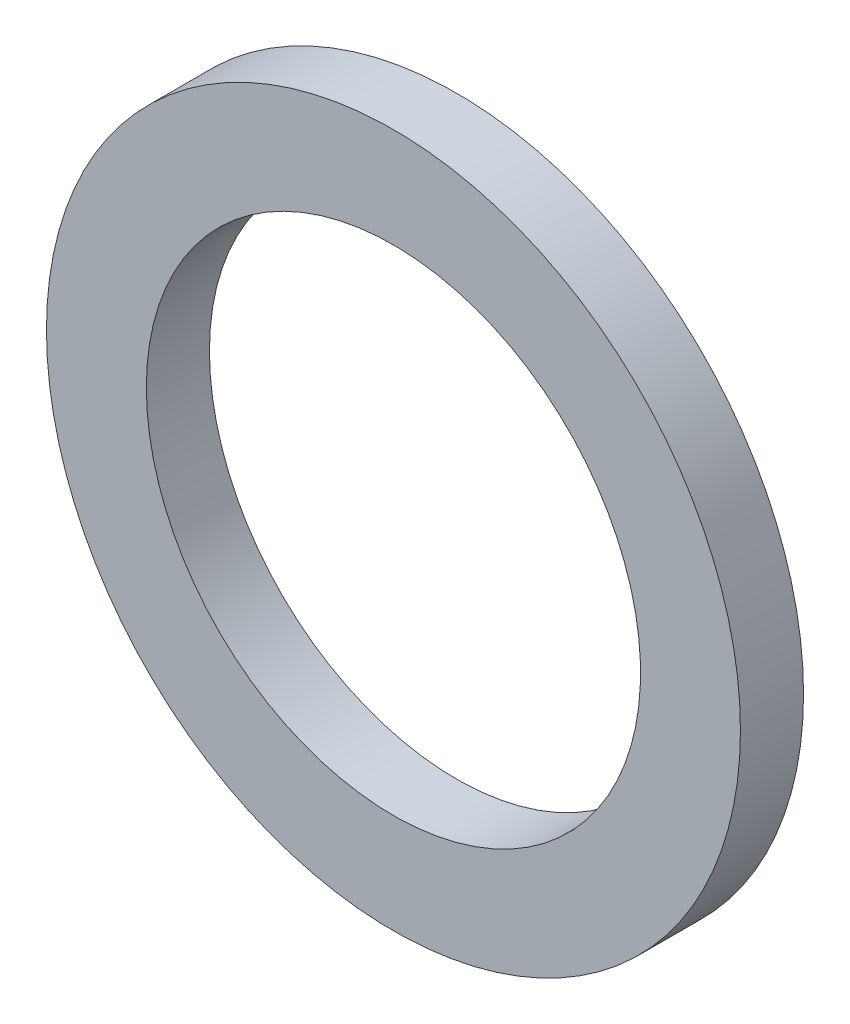
ISO-10303-21;
HEADER;
FILE_DESCRIPTION(('STEP AP214'),'2;1');
FILE_NAME('part.step','',(''),(''),'','','');
FILE_SCHEMA(('AUTOMOTIVE_DESIGN { 1 0 10303 214 1 1 1 1 }'));
ENDSEC;
DATA;
#1=APPLICATION_CONTEXT('core data for automotive mechanical design processes');
#2=APPLICATION_PROTOCOL_DEFINITION('international standard','automotive_design',2000,#1);
#3=PRODUCT_CONTEXT('',#1,'mechanical');
#4=PRODUCT('Part','Part','',(#3));
#5=PRODUCT_RELATED_PRODUCT_CATEGORY('part','',(#4));
#6=PRODUCT_DEFINITION_FORMATION('','',#4);
#7=PRODUCT_DEFINITION_CONTEXT('part definition',#1,'design');
#8=PRODUCT_DEFINITION('design','',#6,#7);
#9=PRODUCT_DEFINITION_SHAPE('','',#8);
#10=(LENGTH_UNIT() NAMED_UNIT(*) SI_UNIT(.MILLI.,.METRE.));
#11=(NAMED_UNIT(*) PLANE_ANGLE_UNIT() SI_UNIT($,.RADIAN.));
#12=(NAMED_UNIT(*) SI_UNIT($,.STERADIAN.) SOLID_ANGLE_UNIT());
#13=UNCERTAINTY_MEASURE_WITH_UNIT(LENGTH_MEASURE(1.E-05),#10,'distance_accuracy_value','');
#14=(GEOMETRIC_REPRESENTATION_CONTEXT(3) GLOBAL_UNCERTAINTY_ASSIGNED_CONTEXT((#13)) GLOBAL_UNIT_ASSIGNED_CONTEXT((#10,
#11,#12)) REPRESENTATION_CONTEXT('',''));
#15=CARTESIAN_POINT('',(0.,0.,0.));
#16=DIRECTION('',(0.,0.,1.));
#17=DIRECTION('',(1.,0.,0.));
#18=AXIS2_PLACEMENT_3D('',#15,#16,#17);
#19=CARTESIAN_POINT('',(0.,0.,1.524));
#20=DIRECTION('',(0.,0.,1.));
#21=DIRECTION('',(1.,0.,0.));
#22=AXIS2_PLACEMENT_3D('',#19,#20,#21);
#23=PLANE('',#22);
#24=CARTESIAN_POINT('',(0.,0.,1.524));
#25=DIRECTION('',(0.,0.,1.));
#26=DIRECTION('',(1.,0.,0.));
#27=AXIS2_PLACEMENT_3D('',#24,#25,#26);
#28=CIRCLE('',#27,8.382);
#29=CARTESIAN_POINT('',(-8.382,0.,1.524));
#30=VERTEX_POINT('',#29);
#31=EDGE_CURVE('E10',#30,#30,#28,.T.);
#32=ORIENTED_EDGE('',*,*,#31,.T.);
#33=EDGE_LOOP('',(#32));
#34=FACE_BOUND('',#33,.T.);
#35=CARTESIAN_POINT('',(0.,0.,1.524));
#36=DIRECTION('',(0.,0.,1.));
#37=DIRECTION('',(1.,0.,0.));
#38=AXIS2_PLACEMENT_3D('',#35,#36,#37);
#39=CIRCLE('',#38,5.969);
#40=CARTESIAN_POINT('',(-5.969,0.,1.524));
#41=VERTEX_POINT('',#40);
#42=EDGE_CURVE('E46',#41,#41,#39,.T.);
#43=ORIENTED_EDGE('',*,*,#42,.F.);
#44=EDGE_LOOP('',(#43));
#45=FACE_BOUND('',#44,.T.);
#46=ADVANCED_FACE('F35',(#34,#45),#23,.T.);
#47=CARTESIAN_POINT('',(0.,0.,0.));
#48=DIRECTION('',(0.,0.,1.));
#49=DIRECTION('',(1.,0.,0.));
#50=AXIS2_PLACEMENT_3D('',#47,#48,#49);
#51=PLANE('',#50);
#52=CARTESIAN_POINT('',(0.,0.,0.));
#53=DIRECTION('',(0.,0.,1.));
#54=DIRECTION('',(1.,0.,0.));
#55=AXIS2_PLACEMENT_3D('',#52,#53,#54);
#56=CIRCLE('',#55,8.382);
#57=CARTESIAN_POINT('',(-8.382,0.,0.));
#58=VERTEX_POINT('',#57);
#59=EDGE_CURVE('E39',#58,#58,#56,.T.);
#60=ORIENTED_EDGE('',*,*,#59,.F.);
#61=EDGE_LOOP('',(#60));
#62=FACE_BOUND('',#61,.T.);
#63=CARTESIAN_POINT('',(0.,0.,0.));
#64=DIRECTION('',(0.,0.,1.));
#65=DIRECTION('',(1.,0.,0.));
#66=AXIS2_PLACEMENT_3D('',#63,#64,#65);
#67=CIRCLE('',#66,5.969);
#68=CARTESIAN_POINT('',(-5.969,0.,0.));
#69=VERTEX_POINT('',#68);
#70=EDGE_CURVE('E48',#69,#69,#67,.T.);
#71=ORIENTED_EDGE('',*,*,#70,.T.);
#72=EDGE_LOOP('',(#71));
#73=FACE_BOUND('',#72,.T.);
#74=ADVANCED_FACE('F58',(#62,#73),#51,.F.);
#75=CARTESIAN_POINT('',(0.,0.,1.524));
#76=DIRECTION('',(0.,0.,-1.));
#77=DIRECTION('',(-1.,0.,0.));
#78=AXIS2_PLACEMENT_3D('',#75,#76,#77);
#79=CYLINDRICAL_SURFACE('',#78,8.382);
#80=CARTESIAN_POINT('',(-8.382,0.,1.524));
#81=CARTESIAN_POINT('',(-8.382,0.,1.508125));
#82=CARTESIAN_POINT('',(-8.382,0.,1.49225));
#83=CARTESIAN_POINT('',(-8.382,0.,1.4605));
#84=CARTESIAN_POINT('',(-8.382,0.,1.444625));
#85=CARTESIAN_POINT('',(-8.382,0.,1.412875));
#86=CARTESIAN_POINT('',(-8.382,0.,1.397));
#87=CARTESIAN_POINT('',(-8.382,0.,1.36525));
#88=CARTESIAN_POINT('',(-8.382,0.,1.349375));
#89=CARTESIAN_POINT('',(-8.382,0.,1.317625));
#90=CARTESIAN_POINT('',(-8.382,0.,1.30175));
#91=CARTESIAN_POINT('',(-8.382,0.,1.27));
#92=CARTESIAN_POINT('',(-8.382,0.,1.254125));
#93=CARTESIAN_POINT('',(-8.382,0.,1.222375));
#94=CARTESIAN_POINT('',(-8.382,0.,1.2065));
#95=CARTESIAN_POINT('',(-8.382,0.,1.17475));
#96=CARTESIAN_POINT('',(-8.382,0.,1.158875));
#97=CARTESIAN_POINT('',(-8.382,0.,1.127125));
#98=CARTESIAN_POINT('',(-8.382,0.,1.11125));
#99=CARTESIAN_POINT('',(-8.382,0.,1.0795));
#100=CARTESIAN_POINT('',(-8.382,0.,1.063625));
#101=CARTESIAN_POINT('',(-8.382,0.,1.031875));
#102=CARTESIAN_POINT('',(-8.382,0.,1.016));
#103=CARTESIAN_POINT('',(-8.382,0.,0.98425));
#104=CARTESIAN_POINT('',(-8.382,0.,0.968375));
#105=CARTESIAN_POINT('',(-8.382,0.,0.936625));
#106=CARTESIAN_POINT('',(-8.382,0.,0.92075));
#107=CARTESIAN_POINT('',(-8.382,0.,0.889));
#108=CARTESIAN_POINT('',(-8.382,0.,0.873125));
#109=CARTESIAN_POINT('',(-8.382,0.,0.841375));
#110=CARTESIAN_POINT('',(-8.382,0.,0.8255));
#111=CARTESIAN_POINT('',(-8.382,0.,0.79375));
#112=CARTESIAN_POINT('',(-8.382,0.,0.777875));
#113=CARTESIAN_POINT('',(-8.382,0.,0.746125));
#114=CARTESIAN_POINT('',(-8.382,0.,0.73025));
#115=CARTESIAN_POINT('',(-8.382,0.,0.6985));
#116=CARTESIAN_POINT('',(-8.382,0.,0.682625));
#117=CARTESIAN_POINT('',(-8.382,0.,0.650875));
#118=CARTESIAN_POINT('',(-8.382,0.,0.635));
#119=CARTESIAN_POINT('',(-8.382,0.,0.60325));
#120=CARTESIAN_POINT('',(-8.382,0.,0.587375));
#121=CARTESIAN_POINT('',(-8.382,0.,0.555625));
#122=CARTESIAN_POINT('',(-8.382,0.,0.53975));
#123=CARTESIAN_POINT('',(-8.382,0.,0.508));
#124=CARTESIAN_POINT('',(-8.382,0.,0.492125));
#125=CARTESIAN_POINT('',(-8.382,0.,0.460375));
#126=CARTESIAN_POINT('',(-8.382,0.,0.4445));
#127=CARTESIAN_POINT('',(-8.382,0.,0.41275));
#128=CARTESIAN_POINT('',(-8.382,0.,0.396875));
#129=CARTESIAN_POINT('',(-8.382,0.,0.365125));
#130=CARTESIAN_POINT('',(-8.382,0.,0.34925));
#131=CARTESIAN_POINT('',(-8.382,0.,0.3175));
#132=CARTESIAN_POINT('',(-8.382,0.,0.301625));
#133=CARTESIAN_POINT('',(-8.382,0.,0.269875));
#134=CARTESIAN_POINT('',(-8.382,0.,0.254));
#135=CARTESIAN_POINT('',(-8.382,0.,0.22225));
#136=CARTESIAN_POINT('',(-8.382,0.,0.206375));
#137=CARTESIAN_POINT('',(-8.382,0.,0.174625));
#138=CARTESIAN_POINT('',(-8.382,0.,0.15875));
#139=CARTESIAN_POINT('',(-8.382,0.,0.127));
#140=CARTESIAN_POINT('',(-8.382,0.,0.111125));
#141=CARTESIAN_POINT('',(-8.382,0.,0.079375));
#142=CARTESIAN_POINT('',(-8.382,0.,0.0635));
#143=CARTESIAN_POINT('',(-8.382,0.,0.0317499999999999));
#144=CARTESIAN_POINT('',(-8.382,0.,0.015875));
#145=CARTESIAN_POINT('',(-8.382,0.,0.));
#146=B_SPLINE_CURVE_WITH_KNOTS('',3,(#80,#81,#82,#83,#84,#85,#86,#87,#88,#89,#90,#91,#92,#93,
#94,#95,#96,#97,#98,#99,#100,#101,#102,#103,#104,#105,#106,#107,#108,#109,#110,#111,#112,#113,
#114,#115,#116,#117,#118,#119,#120,#121,#122,#123,#124,#125,#126,#127,#128,#129,#130,#131,#132,
#133,#134,#135,#136,#137,#138,#139,#140,#141,#142,#143,#144,#145),.UNSPECIFIED.,.F.,.F.,(4,2,2,
2,2,2,2,2,2,2,2,2,2,2,2,2,2,2,2,2,2,2,2,2,2,2,2,2,2,2,2,2,4),(0.,0.0476249999999999,
0.0952499999999998,0.142875,0.1905,0.238125,0.28575,0.333375,0.381,0.428625,0.47625,0.523875,
0.5715,0.619125,0.66675,0.714375,0.762,0.809625,0.85725,0.904875,0.9525,1.000125,1.04775,
1.095375,1.143,1.190625,1.23825,1.285875,1.3335,1.381125,1.42875,1.476375,1.524),.UNSPECIFIED.);
#147=EDGE_CURVE('BSEAM37',#30,#58,#146,.T.);
#148=ORIENTED_EDGE('',*,*,#31,.F.);
#149=ORIENTED_EDGE('',*,*,#59,.T.);
#150=ORIENTED_EDGE('',*,*,#147,.T.);
#151=ORIENTED_EDGE('',*,*,#147,.F.);
#152=EDGE_LOOP('',(#148,#150,#149,#151));
#153=FACE_BOUND('',#152,.T.);
#154=ADVANCED_FACE('F37',(#153),#79,.T.);
#155=CARTESIAN_POINT('',(0.,0.,1.524));
#156=DIRECTION('',(0.,0.,-1.));
#157=DIRECTION('',(-1.,0.,0.));
#158=AXIS2_PLACEMENT_3D('',#155,#156,#157);
#159=CYLINDRICAL_SURFACE('',#158,5.969);
#160=CARTESIAN_POINT('',(-5.969,0.,1.524));
#161=CARTESIAN_POINT('',(-5.969,0.,1.508125));
#162=CARTESIAN_POINT('',(-5.969,0.,1.49225));
#163=CARTESIAN_POINT('',(-5.969,0.,1.4605));
#164=CARTESIAN_POINT('',(-5.969,0.,1.444625));
#165=CARTESIAN_POINT('',(-5.969,0.,1.412875));
#166=CARTESIAN_POINT('',(-5.969,0.,1.397));
#167=CARTESIAN_POINT('',(-5.969,0.,1.36525));
#168=CARTESIAN_POINT('',(-5.969,0.,1.349375));
#169=CARTESIAN_POINT('',(-5.969,0.,1.317625));
#170=CARTESIAN_POINT('',(-5.969,0.,1.30175));
#171=CARTESIAN_POINT('',(-5.969,0.,1.27));
#172=CARTESIAN_POINT('',(-5.969,0.,1.254125));
#173=CARTESIAN_POINT('',(-5.969,0.,1.222375));
#174=CARTESIAN_POINT('',(-5.969,0.,1.2065));
#175=CARTESIAN_POINT('',(-5.969,0.,1.17475));
#176=CARTESIAN_POINT('',(-5.969,0.,1.158875));
#177=CARTESIAN_POINT('',(-5.969,0.,1.127125));
#178=CARTESIAN_POINT('',(-5.969,0.,1.11125));
#179=CARTESIAN_POINT('',(-5.969,0.,1.0795));
#180=CARTESIAN_POINT('',(-5.969,0.,1.063625));
#181=CARTESIAN_POINT('',(-5.969,0.,1.031875));
#182=CARTESIAN_POINT('',(-5.969,0.,1.016));
#183=CARTESIAN_POINT('',(-5.969,0.,0.98425));
#184=CARTESIAN_POINT('',(-5.969,0.,0.968375));
#185=CARTESIAN_POINT('',(-5.969,0.,0.936625));
#186=CARTESIAN_POINT('',(-5.969,0.,0.92075));
#187=CARTESIAN_POINT('',(-5.969,0.,0.889));
#188=CARTESIAN_POINT('',(-5.969,0.,0.873125));
#189=CARTESIAN_POINT('',(-5.969,0.,0.841375));
#190=CARTESIAN_POINT('',(-5.969,0.,0.8255));
#191=CARTESIAN_POINT('',(-5.969,0.,0.79375));
#192=CARTESIAN_POINT('',(-5.969,0.,0.777875));
#193=CARTESIAN_POINT('',(-5.969,0.,0.746125));
#194=CARTESIAN_POINT('',(-5.969,0.,0.73025));
#195=CARTESIAN_POINT('',(-5.969,0.,0.6985));
#196=CARTESIAN_POINT('',(-5.969,0.,0.682625));
#197=CARTESIAN_POINT('',(-5.969,0.,0.650875));
#198=CARTESIAN_POINT('',(-5.969,0.,0.635));
#199=CARTESIAN_POINT('',(-5.969,0.,0.60325));
#200=CARTESIAN_POINT('',(-5.969,0.,0.587375));
#201=CARTESIAN_POINT('',(-5.969,0.,0.555625));
#202=CARTESIAN_POINT('',(-5.969,0.,0.53975));
#203=CARTESIAN_POINT('',(-5.969,0.,0.508));
#204=CARTESIAN_POINT('',(-5.969,0.,0.492125));
#205=CARTESIAN_POINT('',(-5.969,0.,0.460375));
#206=CARTESIAN_POINT('',(-5.969,0.,0.4445));
#207=CARTESIAN_POINT('',(-5.969,0.,0.41275));
#208=CARTESIAN_POINT('',(-5.969,0.,0.396875));
#209=CARTESIAN_POINT('',(-5.969,0.,0.365125));
#210=CARTESIAN_POINT('',(-5.969,0.,0.34925));
#211=CARTESIAN_POINT('',(-5.969,0.,0.3175));
#212=CARTESIAN_POINT('',(-5.969,0.,0.301625));
#213=CARTESIAN_POINT('',(-5.969,0.,0.269875));
#214=CARTESIAN_POINT('',(-5.969,0.,0.254));
#215=CARTESIAN_POINT('',(-5.969,0.,0.22225));
#216=CARTESIAN_POINT('',(-5.969,0.,0.206375));
#217=CARTESIAN_POINT('',(-5.969,0.,0.174625));
#218=CARTESIAN_POINT('',(-5.969,0.,0.15875));
#219=CARTESIAN_POINT('',(-5.969,0.,0.127));
#220=CARTESIAN_POINT('',(-5.969,0.,0.111125));
#221=CARTESIAN_POINT('',(-5.969,0.,0.079375));
#222=CARTESIAN_POINT('',(-5.969,0.,0.0635));
#223=CARTESIAN_POINT('',(-5.969,0.,0.0317499999999999));
#224=CARTESIAN_POINT('',(-5.969,0.,0.015875));
#225=CARTESIAN_POINT('',(-5.969,0.,0.));
#226=B_SPLINE_CURVE_WITH_KNOTS('',3,(#160,#161,#162,#163,#164,#165,#166,#167,#168,#169,#170,
#171,#172,#173,#174,#175,#176,#177,#178,#179,#180,#181,#182,#183,#184,#185,#186,#187,#188,#189,
#190,#191,#192,#193,#194,#195,#196,#197,#198,#199,#200,#201,#202,#203,#204,#205,#206,#207,#208,
#209,#210,#211,#212,#213,#214,#215,#216,#217,#218,#219,#220,#221,#222,#223,#224,#225),
.UNSPECIFIED.,.F.,.F.,(4,2,2,2,2,2,2,2,2,2,2,2,2,2,2,2,2,2,2,2,2,2,2,2,2,2,2,2,2,2,2,2,4),(0.,
0.0476249999999999,0.0952499999999998,0.142875,0.1905,0.238125,0.28575,0.333375,0.381,0.428625,
0.47625,0.523875,0.5715,0.619125,0.66675,0.714375,0.762,0.809625,0.85725,0.904875,0.9525,
1.000125,1.04775,1.095375,1.143,1.190625,1.23825,1.285875,1.3335,1.381125,1.42875,1.476375,
1.524),.UNSPECIFIED.);
#227=EDGE_CURVE('BSEAM54',#41,#69,#226,.T.);
#228=ORIENTED_EDGE('',*,*,#42,.T.);
#229=ORIENTED_EDGE('',*,*,#70,.F.);
#230=ORIENTED_EDGE('',*,*,#227,.T.);
#231=ORIENTED_EDGE('',*,*,#227,.F.);
#232=EDGE_LOOP('',(#228,#230,#229,#231));
#233=FACE_BOUND('',#232,.T.);
#234=ADVANCED_FACE('F54',(#233),#159,.F.);
#235=CLOSED_SHELL('',(#46,#74,#154,#234));
#236=MANIFOLD_SOLID_BREP('B2',#235);
#237=ADVANCED_BREP_SHAPE_REPRESENTATION('',(#18,#236),#14);
#238=SHAPE_DEFINITION_REPRESENTATION(#9,#237);
ENDSEC;
END-ISO-10303-21;
